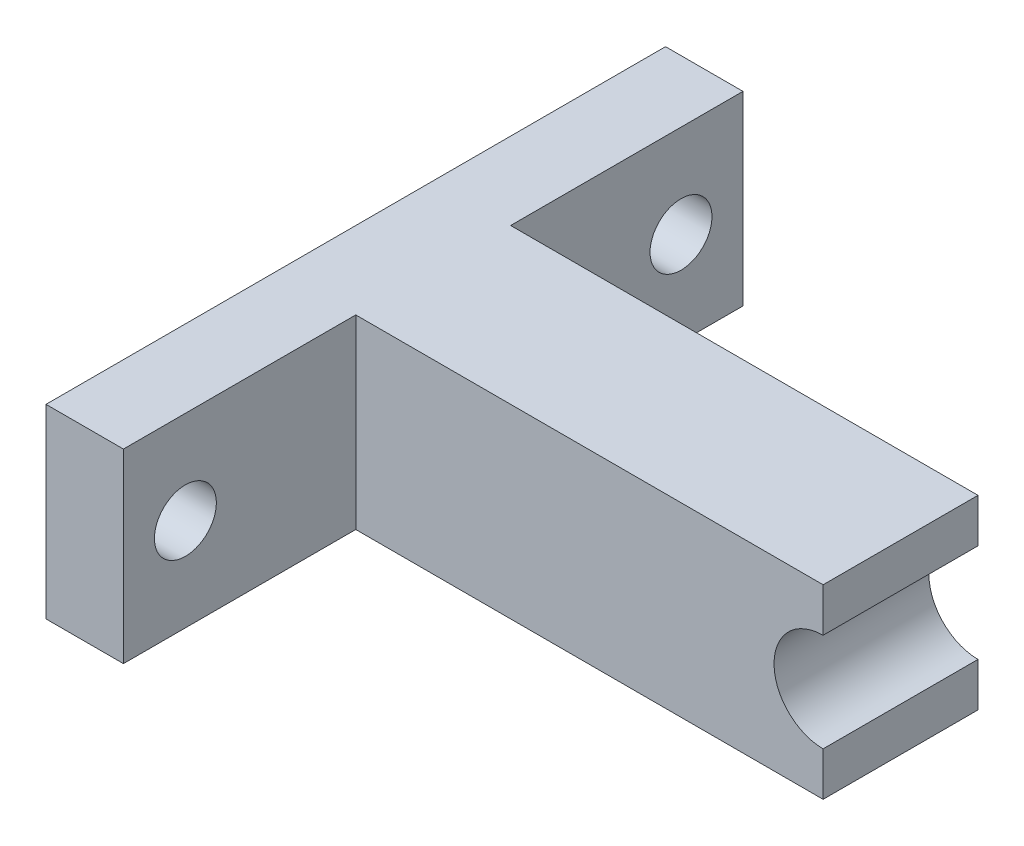
ISO-10303-21;
HEADER;
FILE_DESCRIPTION(('STEP AP214'),'2;1');
FILE_NAME('part.step','',(''),(''),'','','');
FILE_SCHEMA(('AUTOMOTIVE_DESIGN { 1 0 10303 214 1 1 1 1 }'));
ENDSEC;
DATA;
#1=APPLICATION_CONTEXT('core data for automotive mechanical design processes');
#2=APPLICATION_PROTOCOL_DEFINITION('international standard','automotive_design',2000,#1);
#3=PRODUCT_CONTEXT('',#1,'mechanical');
#4=PRODUCT('Part','Part','',(#3));
#5=PRODUCT_RELATED_PRODUCT_CATEGORY('part','',(#4));
#6=PRODUCT_DEFINITION_FORMATION('','',#4);
#7=PRODUCT_DEFINITION_CONTEXT('part definition',#1,'design');
#8=PRODUCT_DEFINITION('design','',#6,#7);
#9=PRODUCT_DEFINITION_SHAPE('','',#8);
#10=(LENGTH_UNIT() NAMED_UNIT(*) SI_UNIT(.MILLI.,.METRE.));
#11=(NAMED_UNIT(*) PLANE_ANGLE_UNIT() SI_UNIT($,.RADIAN.));
#12=(NAMED_UNIT(*) SI_UNIT($,.STERADIAN.) SOLID_ANGLE_UNIT());
#13=UNCERTAINTY_MEASURE_WITH_UNIT(LENGTH_MEASURE(1.E-05),#10,'distance_accuracy_value','');
#14=(GEOMETRIC_REPRESENTATION_CONTEXT(3) GLOBAL_UNCERTAINTY_ASSIGNED_CONTEXT((#13)) GLOBAL_UNIT_ASSIGNED_CONTEXT((#10,
#11,#12)) REPRESENTATION_CONTEXT('',''));
#15=CARTESIAN_POINT('',(0.,0.,0.));
#16=DIRECTION('',(0.,0.,1.));
#17=DIRECTION('',(1.,0.,0.));
#18=AXIS2_PLACEMENT_3D('',#15,#16,#17);
#19=CARTESIAN_POINT('',(35.175,6.,-5.));
#20=DIRECTION('',(-1.,0.,0.));
#21=DIRECTION('',(0.,0.,1.));
#22=AXIS2_PLACEMENT_3D('',#19,#20,#21);
#23=PLANE('',#22);
#24=DIRECTION('',(0.,-1.,0.));
#25=VECTOR('',#24,1.);
#26=CARTESIAN_POINT('',(35.175,6.,-5.));
#27=LINE('',#26,#25);
#28=CARTESIAN_POINT('',(35.175,-3.17499606298968,-5.));
#29=VERTEX_POINT('',#28);
#30=CARTESIAN_POINT('',(35.175,-6.,-5.));
#31=VERTEX_POINT('',#30);
#32=EDGE_CURVE('E141',#29,#31,#27,.T.);
#33=ORIENTED_EDGE('',*,*,#32,.F.);
#34=DIRECTION('',(0.,0.,1.));
#35=VECTOR('',#34,1.);
#36=CARTESIAN_POINT('',(35.175,-3.17499606298968,-17.));
#37=LINE('',#36,#35);
#38=CARTESIAN_POINT('',(35.175,-3.17499606298968,5.));
#39=VERTEX_POINT('',#38);
#40=EDGE_CURVE('E61',#29,#39,#37,.T.);
#41=ORIENTED_EDGE('',*,*,#40,.T.);
#42=DIRECTION('',(0.,-1.,0.));
#43=VECTOR('',#42,1.);
#44=CARTESIAN_POINT('',(35.175,6.,5.));
#45=LINE('',#44,#43);
#46=CARTESIAN_POINT('',(35.175,-6.,5.));
#47=VERTEX_POINT('',#46);
#48=EDGE_CURVE('E140',#39,#47,#45,.T.);
#49=ORIENTED_EDGE('',*,*,#48,.T.);
#50=DIRECTION('',(0.,0.,-1.));
#51=VECTOR('',#50,1.);
#52=CARTESIAN_POINT('',(35.175,-6.,-5.));
#53=LINE('',#52,#51);
#54=EDGE_CURVE('E248',#47,#31,#53,.T.);
#55=ORIENTED_EDGE('',*,*,#54,.T.);
#56=EDGE_LOOP('',(#33,#41,#49,#55));
#57=FACE_BOUND('',#56,.T.);
#58=ADVANCED_FACE('F45',(#57),#23,.F.);
#59=CARTESIAN_POINT('',(5.,0.,0.));
#60=DIRECTION('',(-1.,0.,0.));
#61=DIRECTION('',(0.,0.,1.));
#62=AXIS2_PLACEMENT_3D('',#59,#60,#61);
#63=PLANE('',#62);
#64=CARTESIAN_POINT('',(5.,0.,16.));
#65=DIRECTION('',(1.,0.,0.));
#66=DIRECTION('',(0.,0.,-1.));
#67=AXIS2_PLACEMENT_3D('',#64,#65,#66);
#68=CIRCLE('',#67,2.);
#69=CARTESIAN_POINT('',(5.,0.,14.));
#70=VERTEX_POINT('',#69);
#71=EDGE_CURVE('E164',#70,#70,#68,.T.);
#72=ORIENTED_EDGE('',*,*,#71,.F.);
#73=EDGE_LOOP('',(#72));
#74=FACE_BOUND('',#73,.T.);
#75=DIRECTION('',(0.,-1.,0.));
#76=VECTOR('',#75,1.);
#77=CARTESIAN_POINT('',(5.,6.,5.00000000000001));
#78=LINE('',#77,#76);
#79=CARTESIAN_POINT('',(5.,6.,5.00000000000001));
#80=VERTEX_POINT('',#79);
#81=CARTESIAN_POINT('',(5.,-6.,5.00000000000001));
#82=VERTEX_POINT('',#81);
#83=EDGE_CURVE('E151',#80,#82,#78,.T.);
#84=ORIENTED_EDGE('',*,*,#83,.F.);
#85=DIRECTION('',(0.,0.,1.));
#86=VECTOR('',#85,1.);
#87=CARTESIAN_POINT('',(5.,6.,20.));
#88=LINE('',#87,#86);
#89=CARTESIAN_POINT('',(5.,6.,20.));
#90=VERTEX_POINT('',#89);
#91=EDGE_CURVE('E176',#80,#90,#88,.T.);
#92=ORIENTED_EDGE('',*,*,#91,.T.);
#93=DIRECTION('',(0.,-1.,0.));
#94=VECTOR('',#93,1.);
#95=CARTESIAN_POINT('',(5.,-6.,20.));
#96=LINE('',#95,#94);
#97=CARTESIAN_POINT('',(5.,-6.,20.));
#98=VERTEX_POINT('',#97);
#99=EDGE_CURVE('E182',#90,#98,#96,.T.);
#100=ORIENTED_EDGE('',*,*,#99,.T.);
#101=DIRECTION('',(0.,0.,-1.));
#102=VECTOR('',#101,1.);
#103=CARTESIAN_POINT('',(5.,-6.,20.));
#104=LINE('',#103,#102);
#105=EDGE_CURVE('E186',#98,#82,#104,.T.);
#106=ORIENTED_EDGE('',*,*,#105,.T.);
#107=EDGE_LOOP('',(#84,#92,#100,#106));
#108=FACE_BOUND('',#107,.T.);
#109=ADVANCED_FACE('F239',(#74,#108),#63,.F.);
#110=CARTESIAN_POINT('',(5.,6.,-20.));
#111=VERTEX_POINT('',#110);
#112=CARTESIAN_POINT('',(5.,6.,-4.99999999999999));
#113=VERTEX_POINT('',#112);
#114=EDGE_CURVE('E178',#111,#113,#88,.T.);
#115=ORIENTED_EDGE('',*,*,#114,.T.);
#116=DIRECTION('',(0.,-1.,0.));
#117=VECTOR('',#116,1.);
#118=CARTESIAN_POINT('',(5.,6.,-4.99999999999999));
#119=LINE('',#118,#117);
#120=CARTESIAN_POINT('',(5.,-6.,-4.99999999999999));
#121=VERTEX_POINT('',#120);
#122=EDGE_CURVE('E146',#113,#121,#119,.T.);
#123=ORIENTED_EDGE('',*,*,#122,.T.);
#124=CARTESIAN_POINT('',(5.,-6.,-20.));
#125=VERTEX_POINT('',#124);
#126=EDGE_CURVE('E185',#121,#125,#104,.T.);
#127=ORIENTED_EDGE('',*,*,#126,.T.);
#128=DIRECTION('',(0.,1.,0.));
#129=VECTOR('',#128,1.);
#130=CARTESIAN_POINT('',(5.,-6.,-20.));
#131=LINE('',#130,#129);
#132=EDGE_CURVE('E172',#125,#111,#131,.T.);
#133=ORIENTED_EDGE('',*,*,#132,.T.);
#134=EDGE_LOOP('',(#115,#123,#127,#133));
#135=FACE_BOUND('',#134,.T.);
#136=CARTESIAN_POINT('',(5.,0.,-16.));
#137=DIRECTION('',(1.,0.,0.));
#138=DIRECTION('',(0.,0.,1.));
#139=AXIS2_PLACEMENT_3D('',#136,#137,#138);
#140=CIRCLE('',#139,2.);
#141=CARTESIAN_POINT('',(5.,0.,-14.));
#142=VERTEX_POINT('',#141);
#143=EDGE_CURVE('E156',#142,#142,#140,.T.);
#144=ORIENTED_EDGE('',*,*,#143,.F.);
#145=EDGE_LOOP('',(#144));
#146=FACE_BOUND('',#145,.T.);
#147=ADVANCED_FACE('F245',(#135,#146),#63,.F.);
#148=CARTESIAN_POINT('',(0.,0.,0.));
#149=DIRECTION('',(-1.,0.,0.));
#150=DIRECTION('',(0.,0.,1.));
#151=AXIS2_PLACEMENT_3D('',#148,#149,#150);
#152=PLANE('',#151);
#153=CARTESIAN_POINT('',(0.,0.,16.));
#154=DIRECTION('',(1.,0.,0.));
#155=DIRECTION('',(0.,0.,-1.));
#156=AXIS2_PLACEMENT_3D('',#153,#154,#155);
#157=CIRCLE('',#156,2.);
#158=CARTESIAN_POINT('',(0.,0.,14.));
#159=VERTEX_POINT('',#158);
#160=EDGE_CURVE('E160',#159,#159,#157,.T.);
#161=ORIENTED_EDGE('',*,*,#160,.T.);
#162=EDGE_LOOP('',(#161));
#163=FACE_BOUND('',#162,.T.);
#164=DIRECTION('',(0.,1.,0.));
#165=VECTOR('',#164,1.);
#166=CARTESIAN_POINT('',(0.,-6.,-20.));
#167=LINE('',#166,#165);
#168=CARTESIAN_POINT('',(0.,-6.,-20.));
#169=VERTEX_POINT('',#168);
#170=CARTESIAN_POINT('',(0.,6.,-20.));
#171=VERTEX_POINT('',#170);
#172=EDGE_CURVE('E168',#169,#171,#167,.T.);
#173=ORIENTED_EDGE('',*,*,#172,.F.);
#174=DIRECTION('',(0.,0.,-1.));
#175=VECTOR('',#174,1.);
#176=CARTESIAN_POINT('',(0.,-6.,20.));
#177=LINE('',#176,#175);
#178=CARTESIAN_POINT('',(0.,-6.,20.));
#179=VERTEX_POINT('',#178);
#180=EDGE_CURVE('E177',#179,#169,#177,.T.);
#181=ORIENTED_EDGE('',*,*,#180,.F.);
#182=DIRECTION('',(0.,-1.,0.));
#183=VECTOR('',#182,1.);
#184=CARTESIAN_POINT('',(0.,-6.,20.));
#185=LINE('',#184,#183);
#186=CARTESIAN_POINT('',(0.,6.,20.));
#187=VERTEX_POINT('',#186);
#188=EDGE_CURVE('E197',#187,#179,#185,.T.);
#189=ORIENTED_EDGE('',*,*,#188,.F.);
#190=DIRECTION('',(0.,0.,1.));
#191=VECTOR('',#190,1.);
#192=CARTESIAN_POINT('',(0.,6.,20.));
#193=LINE('',#192,#191);
#194=EDGE_CURVE('E194',#171,#187,#193,.T.);
#195=ORIENTED_EDGE('',*,*,#194,.F.);
#196=EDGE_LOOP('',(#173,#181,#189,#195));
#197=FACE_BOUND('',#196,.T.);
#198=CARTESIAN_POINT('',(0.,0.,-16.));
#199=DIRECTION('',(1.,0.,0.));
#200=DIRECTION('',(0.,0.,1.));
#201=AXIS2_PLACEMENT_3D('',#198,#199,#200);
#202=CIRCLE('',#201,2.);
#203=CARTESIAN_POINT('',(0.,0.,-14.));
#204=VERTEX_POINT('',#203);
#205=EDGE_CURVE('E155',#204,#204,#202,.T.);
#206=ORIENTED_EDGE('',*,*,#205,.T.);
#207=EDGE_LOOP('',(#206));
#208=FACE_BOUND('',#207,.T.);
#209=ADVANCED_FACE('F224',(#163,#197,#208),#152,.T.);
#210=CARTESIAN_POINT('',(5.,-6.,-20.));
#211=DIRECTION('',(0.,0.,1.));
#212=DIRECTION('',(1.,0.,0.));
#213=AXIS2_PLACEMENT_3D('',#210,#211,#212);
#214=PLANE('',#213);
#215=ORIENTED_EDGE('',*,*,#172,.T.);
#216=DIRECTION('',(-1.,0.,0.));
#217=VECTOR('',#216,1.);
#218=CARTESIAN_POINT('',(5.,6.,-20.));
#219=LINE('',#218,#217);
#220=EDGE_CURVE('E54',#111,#171,#219,.T.);
#221=ORIENTED_EDGE('',*,*,#220,.F.);
#222=ORIENTED_EDGE('',*,*,#132,.F.);
#223=DIRECTION('',(-1.,0.,0.));
#224=VECTOR('',#223,1.);
#225=CARTESIAN_POINT('',(5.,-6.,-20.));
#226=LINE('',#225,#224);
#227=EDGE_CURVE('E190',#125,#169,#226,.T.);
#228=ORIENTED_EDGE('',*,*,#227,.T.);
#229=EDGE_LOOP('',(#215,#221,#222,#228));
#230=FACE_BOUND('',#229,.T.);
#231=ADVANCED_FACE('F47',(#230),#214,.F.);
#232=CARTESIAN_POINT('',(5.,6.,20.));
#233=DIRECTION('',(0.,-1.,0.));
#234=DIRECTION('',(0.,0.,-1.));
#235=AXIS2_PLACEMENT_3D('',#232,#233,#234);
#236=PLANE('',#235);
#237=ORIENTED_EDGE('',*,*,#194,.T.);
#238=DIRECTION('',(-1.,0.,0.));
#239=VECTOR('',#238,1.);
#240=CARTESIAN_POINT('',(5.,6.,20.));
#241=LINE('',#240,#239);
#242=EDGE_CURVE('E209',#90,#187,#241,.T.);
#243=ORIENTED_EDGE('',*,*,#242,.F.);
#244=ORIENTED_EDGE('',*,*,#91,.F.);
#245=DIRECTION('',(1.,0.,0.));
#246=VECTOR('',#245,1.);
#247=CARTESIAN_POINT('',(35.175,6.,5.));
#248=LINE('',#247,#246);
#249=CARTESIAN_POINT('',(35.175,6.,5.));
#250=VERTEX_POINT('',#249);
#251=EDGE_CURVE('E250',#80,#250,#248,.T.);
#252=ORIENTED_EDGE('',*,*,#251,.T.);
#253=DIRECTION('',(0.,0.,-1.));
#254=VECTOR('',#253,1.);
#255=CARTESIAN_POINT('',(35.175,6.,-5.));
#256=LINE('',#255,#254);
#257=CARTESIAN_POINT('',(35.175,6.,-5.));
#258=VERTEX_POINT('',#257);
#259=EDGE_CURVE('E253',#250,#258,#256,.T.);
#260=ORIENTED_EDGE('',*,*,#259,.T.);
#261=DIRECTION('',(-1.,0.,0.));
#262=VECTOR('',#261,1.);
#263=CARTESIAN_POINT('',(35.175,6.,-5.));
#264=LINE('',#263,#262);
#265=EDGE_CURVE('E138',#258,#113,#264,.T.);
#266=ORIENTED_EDGE('',*,*,#265,.T.);
#267=ORIENTED_EDGE('',*,*,#114,.F.);
#268=ORIENTED_EDGE('',*,*,#220,.T.);
#269=EDGE_LOOP('',(#237,#243,#244,#252,#260,#266,#267,#268));
#270=FACE_BOUND('',#269,.T.);
#271=ADVANCED_FACE('F216',(#270),#236,.F.);
#272=CARTESIAN_POINT('',(5.,-6.,20.));
#273=DIRECTION('',(0.,0.,-1.));
#274=DIRECTION('',(-1.,0.,0.));
#275=AXIS2_PLACEMENT_3D('',#272,#273,#274);
#276=PLANE('',#275);
#277=ORIENTED_EDGE('',*,*,#188,.T.);
#278=DIRECTION('',(-1.,0.,0.));
#279=VECTOR('',#278,1.);
#280=CARTESIAN_POINT('',(5.,-6.,20.));
#281=LINE('',#280,#279);
#282=EDGE_CURVE('E205',#98,#179,#281,.T.);
#283=ORIENTED_EDGE('',*,*,#282,.F.);
#284=ORIENTED_EDGE('',*,*,#99,.F.);
#285=ORIENTED_EDGE('',*,*,#242,.T.);
#286=EDGE_LOOP('',(#277,#283,#284,#285));
#287=FACE_BOUND('',#286,.T.);
#288=ADVANCED_FACE('F229',(#287),#276,.F.);
#289=CARTESIAN_POINT('',(5.,-6.,20.));
#290=DIRECTION('',(0.,1.,0.));
#291=DIRECTION('',(0.,0.,1.));
#292=AXIS2_PLACEMENT_3D('',#289,#290,#291);
#293=PLANE('',#292);
#294=ORIENTED_EDGE('',*,*,#180,.T.);
#295=ORIENTED_EDGE('',*,*,#227,.F.);
#296=ORIENTED_EDGE('',*,*,#126,.F.);
#297=DIRECTION('',(-1.,0.,0.));
#298=VECTOR('',#297,1.);
#299=CARTESIAN_POINT('',(35.175,-6.,-5.));
#300=LINE('',#299,#298);
#301=EDGE_CURVE('E68',#31,#121,#300,.T.);
#302=ORIENTED_EDGE('',*,*,#301,.F.);
#303=ORIENTED_EDGE('',*,*,#54,.F.);
#304=DIRECTION('',(1.,0.,0.));
#305=VECTOR('',#304,1.);
#306=CARTESIAN_POINT('',(35.175,-6.,5.));
#307=LINE('',#306,#305);
#308=EDGE_CURVE('E236',#82,#47,#307,.T.);
#309=ORIENTED_EDGE('',*,*,#308,.F.);
#310=ORIENTED_EDGE('',*,*,#105,.F.);
#311=ORIENTED_EDGE('',*,*,#282,.T.);
#312=EDGE_LOOP('',(#294,#295,#296,#302,#303,#309,#310,#311));
#313=FACE_BOUND('',#312,.T.);
#314=ADVANCED_FACE('F233',(#313),#293,.F.);
#315=CARTESIAN_POINT('',(5.,0.,16.));
#316=DIRECTION('',(-1.,0.,0.));
#317=DIRECTION('',(0.,0.,1.));
#318=AXIS2_PLACEMENT_3D('',#315,#316,#317);
#319=CYLINDRICAL_SURFACE('',#318,2.);
#320=ORIENTED_EDGE('',*,*,#71,.T.);
#321=EDGE_LOOP('',(#320));
#322=FACE_BOUND('',#321,.T.);
#323=ORIENTED_EDGE('',*,*,#160,.F.);
#324=EDGE_LOOP('',(#323));
#325=FACE_BOUND('',#324,.T.);
#326=ADVANCED_FACE('F281',(#322,#325),#319,.F.);
#327=CARTESIAN_POINT('',(5.,0.,-16.));
#328=DIRECTION('',(-1.,0.,0.));
#329=DIRECTION('',(0.,0.,1.));
#330=AXIS2_PLACEMENT_3D('',#327,#328,#329);
#331=CYLINDRICAL_SURFACE('',#330,2.);
#332=ORIENTED_EDGE('',*,*,#143,.T.);
#333=EDGE_LOOP('',(#332));
#334=FACE_BOUND('',#333,.T.);
#335=ORIENTED_EDGE('',*,*,#205,.F.);
#336=EDGE_LOOP('',(#335));
#337=FACE_BOUND('',#336,.T.);
#338=ADVANCED_FACE('F273',(#334,#337),#331,.F.);
#339=CARTESIAN_POINT('',(35.175,6.,5.));
#340=DIRECTION('',(0.,0.,-1.));
#341=DIRECTION('',(-1.,0.,0.));
#342=AXIS2_PLACEMENT_3D('',#339,#340,#341);
#343=PLANE('',#342);
#344=ORIENTED_EDGE('',*,*,#48,.F.);
#345=CARTESIAN_POINT('',(35.18,0.,5.));
#346=DIRECTION('',(0.,0.,-1.));
#347=DIRECTION('',(-1.,0.,0.));
#348=AXIS2_PLACEMENT_3D('',#345,#346,#347);
#349=CIRCLE('',#348,3.175);
#350=CARTESIAN_POINT('',(35.175,3.17499606298968,5.));
#351=VERTEX_POINT('',#350);
#352=EDGE_CURVE('E259',#39,#351,#349,.T.);
#353=ORIENTED_EDGE('',*,*,#352,.T.);
#354=EDGE_CURVE('E134',#250,#351,#45,.T.);
#355=ORIENTED_EDGE('',*,*,#354,.F.);
#356=ORIENTED_EDGE('',*,*,#251,.F.);
#357=ORIENTED_EDGE('',*,*,#83,.T.);
#358=ORIENTED_EDGE('',*,*,#308,.T.);
#359=EDGE_LOOP('',(#344,#353,#355,#356,#357,#358));
#360=FACE_BOUND('',#359,.T.);
#361=ADVANCED_FACE('F270',(#360),#343,.F.);
#362=ORIENTED_EDGE('',*,*,#354,.T.);
#363=DIRECTION('',(0.,0.,1.));
#364=VECTOR('',#363,1.);
#365=CARTESIAN_POINT('',(35.175,3.17499606298968,-17.));
#366=LINE('',#365,#364);
#367=CARTESIAN_POINT('',(35.175,3.17499606298968,-5.));
#368=VERTEX_POINT('',#367);
#369=EDGE_CURVE('E122',#351,#368,#366,.F.);
#370=ORIENTED_EDGE('',*,*,#369,.T.);
#371=EDGE_CURVE('E131',#258,#368,#27,.T.);
#372=ORIENTED_EDGE('',*,*,#371,.F.);
#373=ORIENTED_EDGE('',*,*,#259,.F.);
#374=EDGE_LOOP('',(#362,#370,#372,#373));
#375=FACE_BOUND('',#374,.T.);
#376=ADVANCED_FACE('F129',(#375),#23,.F.);
#377=CARTESIAN_POINT('',(35.175,6.,-5.));
#378=DIRECTION('',(0.,0.,1.));
#379=DIRECTION('',(1.,0.,0.));
#380=AXIS2_PLACEMENT_3D('',#377,#378,#379);
#381=PLANE('',#380);
#382=ORIENTED_EDGE('',*,*,#371,.T.);
#383=CARTESIAN_POINT('',(35.18,0.,-5.));
#384=DIRECTION('',(0.,0.,1.));
#385=DIRECTION('',(1.,0.,0.));
#386=AXIS2_PLACEMENT_3D('',#383,#384,#385);
#387=CIRCLE('',#386,3.175);
#388=EDGE_CURVE('E11',#368,#29,#387,.T.);
#389=ORIENTED_EDGE('',*,*,#388,.T.);
#390=ORIENTED_EDGE('',*,*,#32,.T.);
#391=ORIENTED_EDGE('',*,*,#301,.T.);
#392=ORIENTED_EDGE('',*,*,#122,.F.);
#393=ORIENTED_EDGE('',*,*,#265,.F.);
#394=EDGE_LOOP('',(#382,#389,#390,#391,#392,#393));
#395=FACE_BOUND('',#394,.T.);
#396=ADVANCED_FACE('F137',(#395),#381,.F.);
#397=CARTESIAN_POINT('',(35.18,0.,-17.));
#398=DIRECTION('',(0.,0.,1.));
#399=DIRECTION('',(1.,0.,0.));
#400=AXIS2_PLACEMENT_3D('',#397,#398,#399);
#401=CYLINDRICAL_SURFACE('',#400,3.175);
#402=ORIENTED_EDGE('',*,*,#40,.F.);
#403=ORIENTED_EDGE('',*,*,#388,.F.);
#404=ORIENTED_EDGE('',*,*,#369,.F.);
#405=ORIENTED_EDGE('',*,*,#352,.F.);
#406=EDGE_LOOP('',(#402,#403,#404,#405));
#407=FACE_BOUND('',#406,.T.);
#408=ADVANCED_FACE('F121',(#407),#401,.F.);
#409=CLOSED_SHELL('',(#58,#109,#147,#209,#231,#271,#288,#314,#326,#338,#361,#376,#396,#408));
#410=MANIFOLD_SOLID_BREP('B2',#409);
#411=ADVANCED_BREP_SHAPE_REPRESENTATION('',(#18,#410),#14);
#412=SHAPE_DEFINITION_REPRESENTATION(#9,#411);
ENDSEC;
END-ISO-10303-21;
